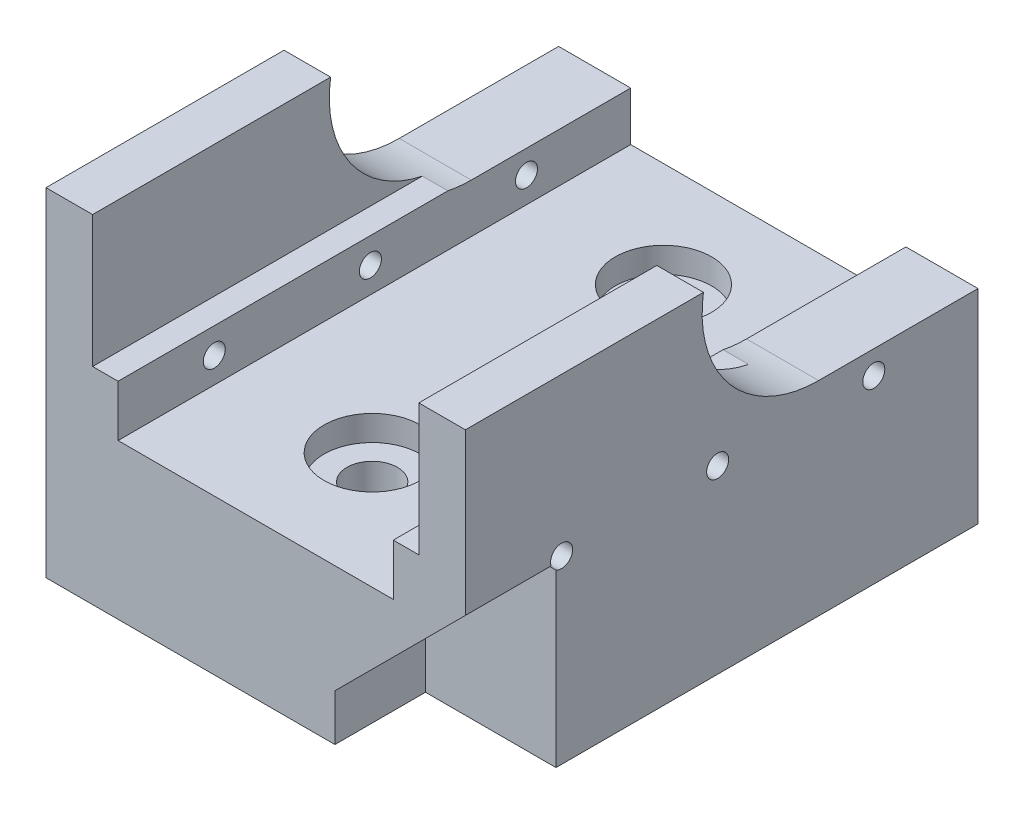
ISO-10303-21;
HEADER;
FILE_DESCRIPTION(('STEP AP214'),'2;1');
FILE_NAME('part.step','',(''),(''),'','','');
FILE_SCHEMA(('AUTOMOTIVE_DESIGN { 1 0 10303 214 1 1 1 1 }'));
ENDSEC;
DATA;
#1=APPLICATION_CONTEXT('core data for automotive mechanical design processes');
#2=APPLICATION_PROTOCOL_DEFINITION('international standard','automotive_design',2000,#1);
#3=PRODUCT_CONTEXT('',#1,'mechanical');
#4=PRODUCT('Part','Part','',(#3));
#5=PRODUCT_RELATED_PRODUCT_CATEGORY('part','',(#4));
#6=PRODUCT_DEFINITION_FORMATION('','',#4);
#7=PRODUCT_DEFINITION_CONTEXT('part definition',#1,'design');
#8=PRODUCT_DEFINITION('design','',#6,#7);
#9=PRODUCT_DEFINITION_SHAPE('','',#8);
#10=(LENGTH_UNIT() NAMED_UNIT(*) SI_UNIT(.MILLI.,.METRE.));
#11=(NAMED_UNIT(*) PLANE_ANGLE_UNIT() SI_UNIT($,.RADIAN.));
#12=(NAMED_UNIT(*) SI_UNIT($,.STERADIAN.) SOLID_ANGLE_UNIT());
#13=UNCERTAINTY_MEASURE_WITH_UNIT(LENGTH_MEASURE(1.E-05),#10,'distance_accuracy_value','');
#14=(GEOMETRIC_REPRESENTATION_CONTEXT(3) GLOBAL_UNCERTAINTY_ASSIGNED_CONTEXT((#13)) GLOBAL_UNIT_ASSIGNED_CONTEXT((#10,
#11,#12)) REPRESENTATION_CONTEXT('',''));
#15=CARTESIAN_POINT('',(0.,0.,0.));
#16=DIRECTION('',(0.,0.,1.));
#17=DIRECTION('',(1.,0.,0.));
#18=AXIS2_PLACEMENT_3D('',#15,#16,#17);
#19=CARTESIAN_POINT('',(-14.9999954,27.305,-30.48));
#20=DIRECTION('',(-1.,0.,0.));
#21=DIRECTION('',(0.,0.,1.));
#22=AXIS2_PLACEMENT_3D('',#19,#20,#21);
#23=PLANE('',#22);
#24=CARTESIAN_POINT('',(-14.9999954,10.16,-2.1008086));
#25=DIRECTION('',(-1.,0.,0.));
#26=DIRECTION('',(0.,0.,1.));
#27=AXIS2_PLACEMENT_3D('',#24,#25,#26);
#28=CIRCLE('',#27,1.19999999999999);
#29=CARTESIAN_POINT('',(-14.9999954,10.16,-0.900808600000012));
#30=VERTEX_POINT('',#29);
#31=EDGE_CURVE('E265',#30,#30,#28,.T.);
#32=ORIENTED_EDGE('',*,*,#31,.T.);
#33=EDGE_LOOP('',(#32));
#34=FACE_BOUND('',#33,.T.);
#35=CARTESIAN_POINT('',(-14.9999954,10.16,14.9171914));
#36=DIRECTION('',(-1.,0.,0.));
#37=DIRECTION('',(0.,0.,1.));
#38=AXIS2_PLACEMENT_3D('',#35,#36,#37);
#39=CIRCLE('',#38,1.19999999999999);
#40=CARTESIAN_POINT('',(-14.9999954,10.16,16.1171914));
#41=VERTEX_POINT('',#40);
#42=EDGE_CURVE('E277',#41,#41,#39,.T.);
#43=ORIENTED_EDGE('',*,*,#42,.T.);
#44=EDGE_LOOP('',(#43));
#45=FACE_BOUND('',#44,.T.);
#46=CARTESIAN_POINT('',(-14.9999954,10.16,-19.1188086));
#47=DIRECTION('',(-1.,0.,0.));
#48=DIRECTION('',(0.,0.,1.));
#49=AXIS2_PLACEMENT_3D('',#46,#47,#48);
#50=CIRCLE('',#49,1.19999999999999);
#51=CARTESIAN_POINT('',(-14.9999954,10.16,-17.9188086));
#52=VERTEX_POINT('',#51);
#53=EDGE_CURVE('E309',#52,#52,#50,.T.);
#54=ORIENTED_EDGE('',*,*,#53,.T.);
#55=EDGE_LOOP('',(#54));
#56=FACE_BOUND('',#55,.T.);
#57=DIRECTION('',(0.,1.,0.));
#58=VECTOR('',#57,1.);
#59=CARTESIAN_POINT('',(-14.9999954,27.305,25.4000000000001));
#60=LINE('',#59,#58);
#61=CARTESIAN_POINT('',(-14.9999954,7.3600056,25.4000000000001));
#62=VERTEX_POINT('',#61);
#63=CARTESIAN_POINT('',(-14.9999954,12.9600198000048,25.4000000000001));
#64=VERTEX_POINT('',#63);
#65=EDGE_CURVE('E322',#62,#64,#60,.T.);
#66=ORIENTED_EDGE('',*,*,#65,.F.);
#67=DIRECTION('',(0.,0.,1.));
#68=VECTOR('',#67,1.);
#69=CARTESIAN_POINT('',(-14.9999954,7.3600056,30.4800000000251));
#70=LINE('',#69,#68);
#71=CARTESIAN_POINT('',(-14.9999954,7.3600056,-30.48));
#72=VERTEX_POINT('',#71);
#73=EDGE_CURVE('E329',#72,#62,#70,.T.);
#74=ORIENTED_EDGE('',*,*,#73,.F.);
#75=DIRECTION('',(0.,-1.,0.));
#76=VECTOR('',#75,1.);
#77=CARTESIAN_POINT('',(-14.9999954,27.305,-30.48));
#78=LINE('',#77,#76);
#79=CARTESIAN_POINT('',(-14.9999954,12.7,-30.48));
#80=VERTEX_POINT('',#79);
#81=EDGE_CURVE('E290',#80,#72,#78,.T.);
#82=ORIENTED_EDGE('',*,*,#81,.F.);
#83=DIRECTION('',(0.,0.,1.));
#84=VECTOR('',#83,1.);
#85=CARTESIAN_POINT('',(-14.9999954,12.7,-30.48));
#86=LINE('',#85,#84);
#87=CARTESIAN_POINT('',(-14.9999954,12.7,-13.105000048));
#88=VERTEX_POINT('',#87);
#89=EDGE_CURVE('E246',#80,#88,#86,.T.);
#90=ORIENTED_EDGE('',*,*,#89,.T.);
#91=CARTESIAN_POINT('',(-14.9999954,25.4,-13.105000048));
#92=DIRECTION('',(-1.,0.,0.));
#93=DIRECTION('',(0.,0.,1.));
#94=AXIS2_PLACEMENT_3D('',#91,#92,#93);
#95=CIRCLE('',#94,12.7);
#96=CARTESIAN_POINT('',(-14.9999954,12.9600198000048,-10.5482652898117));
#97=VERTEX_POINT('',#96);
#98=EDGE_CURVE('E231',#88,#97,#95,.T.);
#99=ORIENTED_EDGE('',*,*,#98,.T.);
#100=DIRECTION('',(0.,0.,1.));
#101=VECTOR('',#100,1.);
#102=CARTESIAN_POINT('',(-14.9999954,12.9600198000048,-30.48));
#103=LINE('',#102,#101);
#104=EDGE_CURVE('E256',#97,#64,#103,.T.);
#105=ORIENTED_EDGE('',*,*,#104,.T.);
#106=EDGE_LOOP('',(#66,#74,#82,#90,#99,#105));
#107=FACE_BOUND('',#106,.T.);
#108=ADVANCED_FACE('F36',(#34,#45,#56,#107),#23,.F.);
#109=CARTESIAN_POINT('',(14.9999954,27.305,-30.48));
#110=DIRECTION('',(1.,0.,0.));
#111=DIRECTION('',(0.,0.,-1.));
#112=AXIS2_PLACEMENT_3D('',#109,#110,#111);
#113=PLANE('',#112);
#114=CARTESIAN_POINT('',(14.9999954,10.16,-2.1008086));
#115=DIRECTION('',(1.,0.,0.));
#116=DIRECTION('',(0.,0.,-1.));
#117=AXIS2_PLACEMENT_3D('',#114,#115,#116);
#118=CIRCLE('',#117,1.19999999999999);
#119=CARTESIAN_POINT('',(14.9999954,10.16,-3.3008086));
#120=VERTEX_POINT('',#119);
#121=EDGE_CURVE('E271',#120,#120,#118,.T.);
#122=ORIENTED_EDGE('',*,*,#121,.T.);
#123=EDGE_LOOP('',(#122));
#124=FACE_BOUND('',#123,.T.);
#125=CARTESIAN_POINT('',(14.9999954,10.16,14.9171914));
#126=DIRECTION('',(1.,0.,0.));
#127=DIRECTION('',(0.,0.,-1.));
#128=AXIS2_PLACEMENT_3D('',#125,#126,#127);
#129=CIRCLE('',#128,1.19999999999999);
#130=CARTESIAN_POINT('',(14.9999954,10.16,13.7171914));
#131=VERTEX_POINT('',#130);
#132=EDGE_CURVE('E279',#131,#131,#129,.T.);
#133=ORIENTED_EDGE('',*,*,#132,.T.);
#134=EDGE_LOOP('',(#133));
#135=FACE_BOUND('',#134,.T.);
#136=CARTESIAN_POINT('',(14.9999954,10.16,-19.1188086));
#137=DIRECTION('',(1.,0.,0.));
#138=DIRECTION('',(0.,0.,-1.));
#139=AXIS2_PLACEMENT_3D('',#136,#137,#138);
#140=CIRCLE('',#139,1.19999999999999);
#141=CARTESIAN_POINT('',(14.9999954,10.16,-20.3188086));
#142=VERTEX_POINT('',#141);
#143=EDGE_CURVE('E303',#142,#142,#140,.T.);
#144=ORIENTED_EDGE('',*,*,#143,.T.);
#145=EDGE_LOOP('',(#144));
#146=FACE_BOUND('',#145,.T.);
#147=DIRECTION('',(0.,-1.,0.));
#148=VECTOR('',#147,1.);
#149=CARTESIAN_POINT('',(14.9999954,27.305,25.4000000000004));
#150=LINE('',#149,#148);
#151=CARTESIAN_POINT('',(14.9999954,12.9600198000048,25.4000000000004));
#152=VERTEX_POINT('',#151);
#153=CARTESIAN_POINT('',(14.9999954,7.3600056,25.4000000000002));
#154=VERTEX_POINT('',#153);
#155=EDGE_CURVE('E59',#152,#154,#150,.T.);
#156=ORIENTED_EDGE('',*,*,#155,.F.);
#157=DIRECTION('',(0.,0.,-1.));
#158=VECTOR('',#157,1.);
#159=CARTESIAN_POINT('',(14.9999954,12.9600198000048,-30.48));
#160=LINE('',#159,#158);
#161=CARTESIAN_POINT('',(14.9999954,12.9600198000048,-10.5482652898117));
#162=VERTEX_POINT('',#161);
#163=EDGE_CURVE('E312',#152,#162,#160,.T.);
#164=ORIENTED_EDGE('',*,*,#163,.T.);
#165=CARTESIAN_POINT('',(14.9999954,25.4,-13.105000048));
#166=DIRECTION('',(1.,0.,0.));
#167=DIRECTION('',(0.,0.,-1.));
#168=AXIS2_PLACEMENT_3D('',#165,#166,#167);
#169=CIRCLE('',#168,12.7);
#170=CARTESIAN_POINT('',(14.9999954,12.7,-13.105000048));
#171=VERTEX_POINT('',#170);
#172=EDGE_CURVE('E240',#162,#171,#169,.T.);
#173=ORIENTED_EDGE('',*,*,#172,.T.);
#174=DIRECTION('',(0.,0.,-1.));
#175=VECTOR('',#174,1.);
#176=CARTESIAN_POINT('',(14.9999954,12.7,-30.48));
#177=LINE('',#176,#175);
#178=CARTESIAN_POINT('',(14.9999954,12.7,-30.48));
#179=VERTEX_POINT('',#178);
#180=EDGE_CURVE('E317',#171,#179,#177,.T.);
#181=ORIENTED_EDGE('',*,*,#180,.T.);
#182=DIRECTION('',(0.,-1.,0.));
#183=VECTOR('',#182,1.);
#184=CARTESIAN_POINT('',(14.9999954,27.305,-30.48));
#185=LINE('',#184,#183);
#186=CARTESIAN_POINT('',(14.9999954,7.3600056,-30.48));
#187=VERTEX_POINT('',#186);
#188=EDGE_CURVE('E282',#179,#187,#185,.T.);
#189=ORIENTED_EDGE('',*,*,#188,.T.);
#190=DIRECTION('',(0.,0.,-1.));
#191=VECTOR('',#190,1.);
#192=CARTESIAN_POINT('',(14.9999954,7.3600056,30.4800000000251));
#193=LINE('',#192,#191);
#194=EDGE_CURVE('E337',#154,#187,#193,.T.);
#195=ORIENTED_EDGE('',*,*,#194,.F.);
#196=EDGE_LOOP('',(#156,#164,#173,#181,#189,#195));
#197=FACE_BOUND('',#196,.T.);
#198=ADVANCED_FACE('F445',(#124,#135,#146,#197),#113,.F.);
#199=CARTESIAN_POINT('',(0.,27.305,0.));
#200=DIRECTION('',(0.,1.,0.));
#201=DIRECTION('',(0.,0.,1.));
#202=AXIS2_PLACEMENT_3D('',#199,#200,#201);
#203=PLANE('',#202);
#204=DIRECTION('',(0.,0.,-1.));
#205=VECTOR('',#204,1.);
#206=CARTESIAN_POINT('',(17.78,27.3050000000126,400000.));
#207=LINE('',#206,#205);
#208=CARTESIAN_POINT('',(17.78,27.3050000000126,25.4000000000004));
#209=VERTEX_POINT('',#208);
#210=CARTESIAN_POINT('',(17.78,27.3050000000126,-0.548687890365808));
#211=VERTEX_POINT('',#210);
#212=EDGE_CURVE('E250',#209,#211,#207,.T.);
#213=ORIENTED_EDGE('',*,*,#212,.F.);
#214=DIRECTION('',(-1.,0.,0.));
#215=VECTOR('',#214,1.);
#216=CARTESIAN_POINT('',(-22.8599999999999,27.3050000000126,25.4));
#217=LINE('',#216,#215);
#218=CARTESIAN_POINT('',(22.8600000000001,27.3050000000126,25.4000000000005));
#219=VERTEX_POINT('',#218);
#220=EDGE_CURVE('E374',#219,#209,#217,.T.);
#221=ORIENTED_EDGE('',*,*,#220,.F.);
#222=DIRECTION('',(0.,0.,-1.));
#223=VECTOR('',#222,1.);
#224=CARTESIAN_POINT('',(22.86,27.305,-30.48));
#225=LINE('',#224,#223);
#226=CARTESIAN_POINT('',(22.86,27.305,-0.548687890363902));
#227=VERTEX_POINT('',#226);
#228=EDGE_CURVE('E285',#219,#227,#225,.T.);
#229=ORIENTED_EDGE('',*,*,#228,.T.);
#230=DIRECTION('',(1.,0.,0.));
#231=VECTOR('',#230,1.);
#232=CARTESIAN_POINT('',(-22.86,27.305,-0.548687890363903));
#233=LINE('',#232,#231);
#234=EDGE_CURVE('E243',#211,#227,#233,.T.);
#235=ORIENTED_EDGE('',*,*,#234,.F.);
#236=EDGE_LOOP('',(#213,#221,#229,#235));
#237=FACE_BOUND('',#236,.T.);
#238=ADVANCED_FACE('F372',(#237),#203,.T.);
#239=CARTESIAN_POINT('',(0.,27.305,0.));
#240=DIRECTION('',(0.,1.,0.));
#241=DIRECTION('',(0.,0.,1.));
#242=AXIS2_PLACEMENT_3D('',#239,#240,#241);
#243=PLANE('',#242);
#244=DIRECTION('',(0.,0.,1.));
#245=VECTOR('',#244,1.);
#246=CARTESIAN_POINT('',(-22.86,27.305,-30.48));
#247=LINE('',#246,#245);
#248=CARTESIAN_POINT('',(-22.86,27.305,-0.548687890363902));
#249=VERTEX_POINT('',#248);
#250=CARTESIAN_POINT('',(-22.8599999999999,27.3050000000126,25.4));
#251=VERTEX_POINT('',#250);
#252=EDGE_CURVE('E287',#249,#251,#247,.T.);
#253=ORIENTED_EDGE('',*,*,#252,.T.);
#254=CARTESIAN_POINT('',(-17.78,27.3050000000126,25.4));
#255=VERTEX_POINT('',#254);
#256=EDGE_CURVE('E485',#255,#251,#217,.T.);
#257=ORIENTED_EDGE('',*,*,#256,.F.);
#258=DIRECTION('',(0.,0.,-1.));
#259=VECTOR('',#258,1.);
#260=CARTESIAN_POINT('',(-17.78,27.3050000000126,400000.));
#261=LINE('',#260,#259);
#262=CARTESIAN_POINT('',(-17.78,27.3050000000126,-0.548687890365808));
#263=VERTEX_POINT('',#262);
#264=EDGE_CURVE('E249',#255,#263,#261,.T.);
#265=ORIENTED_EDGE('',*,*,#264,.T.);
#266=DIRECTION('',(1.,0.,0.));
#267=VECTOR('',#266,1.);
#268=CARTESIAN_POINT('',(-22.86,27.305,-0.548687890363903));
#269=LINE('',#268,#267);
#270=EDGE_CURVE('E228',#249,#263,#269,.T.);
#271=ORIENTED_EDGE('',*,*,#270,.F.);
#272=EDGE_LOOP('',(#253,#257,#265,#271));
#273=FACE_BOUND('',#272,.T.);
#274=ADVANCED_FACE('F456',(#273),#243,.T.);
#275=CARTESIAN_POINT('',(-22.86,6.35,-30.48));
#276=DIRECTION('',(1.,0.,0.));
#277=DIRECTION('',(0.,0.,-1.));
#278=AXIS2_PLACEMENT_3D('',#275,#276,#277);
#279=PLANE('',#278);
#280=CARTESIAN_POINT('',(-22.86,10.16,-19.1188086));
#281=DIRECTION('',(1.,0.,0.));
#282=DIRECTION('',(0.,0.,-1.));
#283=AXIS2_PLACEMENT_3D('',#280,#281,#282);
#284=CIRCLE('',#283,1.19999999999999);
#285=CARTESIAN_POINT('',(-22.86,10.16,-20.3188086));
#286=VERTEX_POINT('',#285);
#287=EDGE_CURVE('E306',#286,#286,#284,.F.);
#288=ORIENTED_EDGE('',*,*,#287,.F.);
#289=EDGE_LOOP('',(#288));
#290=FACE_BOUND('',#289,.T.);
#291=CARTESIAN_POINT('',(-22.86,10.16,14.9171914));
#292=DIRECTION('',(1.,0.,0.));
#293=DIRECTION('',(0.,0.,-1.));
#294=AXIS2_PLACEMENT_3D('',#291,#292,#293);
#295=CIRCLE('',#294,1.19999999999999);
#296=CARTESIAN_POINT('',(-22.86,10.16,13.7171914));
#297=VERTEX_POINT('',#296);
#298=EDGE_CURVE('E274',#297,#297,#295,.F.);
#299=ORIENTED_EDGE('',*,*,#298,.F.);
#300=EDGE_LOOP('',(#299));
#301=FACE_BOUND('',#300,.T.);
#302=CARTESIAN_POINT('',(-22.86,10.16,-2.1008086));
#303=DIRECTION('',(1.,0.,0.));
#304=DIRECTION('',(0.,0.,-1.));
#305=AXIS2_PLACEMENT_3D('',#302,#303,#304);
#306=CIRCLE('',#305,1.19999999999999);
#307=CARTESIAN_POINT('',(-22.86,10.16,-3.3008086));
#308=VERTEX_POINT('',#307);
#309=EDGE_CURVE('E262',#308,#308,#306,.F.);
#310=ORIENTED_EDGE('',*,*,#309,.F.);
#311=EDGE_LOOP('',(#310));
#312=FACE_BOUND('',#311,.T.);
#313=DIRECTION('',(0.,-1.,0.));
#314=VECTOR('',#313,1.);
#315=CARTESIAN_POINT('',(-22.8599999999999,-9.525,25.4));
#316=LINE('',#315,#314);
#317=CARTESIAN_POINT('',(-22.8599999999999,-9.525,25.4));
#318=VERTEX_POINT('',#317);
#319=EDGE_CURVE('E376',#251,#318,#316,.T.);
#320=ORIENTED_EDGE('',*,*,#319,.F.);
#321=ORIENTED_EDGE('',*,*,#252,.F.);
#322=CARTESIAN_POINT('',(-22.86,25.4,-13.105000048));
#323=DIRECTION('',(1.,0.,0.));
#324=DIRECTION('',(0.,0.,-1.));
#325=AXIS2_PLACEMENT_3D('',#322,#323,#324);
#326=CIRCLE('',#325,12.7);
#327=CARTESIAN_POINT('',(-22.86,12.7,-13.105000048));
#328=VERTEX_POINT('',#327);
#329=EDGE_CURVE('E210',#249,#328,#326,.T.);
#330=ORIENTED_EDGE('',*,*,#329,.T.);
#331=DIRECTION('',(0.,0.,-1.));
#332=VECTOR('',#331,1.);
#333=CARTESIAN_POINT('',(-22.86,12.7,-13.105000048));
#334=LINE('',#333,#332);
#335=CARTESIAN_POINT('',(-22.86,12.7,-30.48));
#336=VERTEX_POINT('',#335);
#337=EDGE_CURVE('E213',#328,#336,#334,.T.);
#338=ORIENTED_EDGE('',*,*,#337,.T.);
#339=DIRECTION('',(0.,-1.,0.));
#340=VECTOR('',#339,1.);
#341=CARTESIAN_POINT('',(-22.86,6.35,-30.48));
#342=LINE('',#341,#340);
#343=CARTESIAN_POINT('',(-22.86,-9.525,-30.48));
#344=VERTEX_POINT('',#343);
#345=EDGE_CURVE('E293',#336,#344,#342,.T.);
#346=ORIENTED_EDGE('',*,*,#345,.T.);
#347=DIRECTION('',(0.,0.,-1.));
#348=VECTOR('',#347,1.);
#349=CARTESIAN_POINT('',(-22.86,-9.525,30.48));
#350=LINE('',#349,#348);
#351=EDGE_CURVE('E206',#318,#344,#350,.T.);
#352=ORIENTED_EDGE('',*,*,#351,.F.);
#353=EDGE_LOOP('',(#320,#321,#330,#338,#346,#352));
#354=FACE_BOUND('',#353,.T.);
#355=ADVANCED_FACE('F353',(#290,#301,#312,#354),#279,.F.);
#356=CARTESIAN_POINT('',(22.86,6.35,-30.48));
#357=DIRECTION('',(-1.,0.,0.));
#358=DIRECTION('',(0.,0.,1.));
#359=AXIS2_PLACEMENT_3D('',#356,#357,#358);
#360=PLANE('',#359);
#361=CARTESIAN_POINT('',(22.86,10.16,-19.1188086));
#362=DIRECTION('',(1.,0.,0.));
#363=DIRECTION('',(0.,0.,-1.));
#364=AXIS2_PLACEMENT_3D('',#361,#362,#363);
#365=CIRCLE('',#364,1.19999999999999);
#366=CARTESIAN_POINT('',(22.86,10.16,-20.3188086));
#367=VERTEX_POINT('',#366);
#368=EDGE_CURVE('E298',#367,#367,#365,.T.);
#369=ORIENTED_EDGE('',*,*,#368,.F.);
#370=EDGE_LOOP('',(#369));
#371=FACE_BOUND('',#370,.T.);
#372=CARTESIAN_POINT('',(22.86,10.16,-2.1008086));
#373=DIRECTION('',(1.,0.,0.));
#374=DIRECTION('',(0.,0.,-1.));
#375=AXIS2_PLACEMENT_3D('',#372,#373,#374);
#376=CIRCLE('',#375,1.19999999999999);
#377=CARTESIAN_POINT('',(22.86,10.16,-3.3008086));
#378=VERTEX_POINT('',#377);
#379=EDGE_CURVE('E268',#378,#378,#376,.T.);
#380=ORIENTED_EDGE('',*,*,#379,.F.);
#381=EDGE_LOOP('',(#380));
#382=FACE_BOUND('',#381,.T.);
#383=DIRECTION('',(0.,-1.,0.));
#384=VECTOR('',#383,1.);
#385=CARTESIAN_POINT('',(22.8600000000001,-9.525,25.4000000000005));
#386=LINE('',#385,#384);
#387=CARTESIAN_POINT('',(22.8600000000001,9.77899999999995,25.4000000000005));
#388=VERTEX_POINT('',#387);
#389=EDGE_CURVE('E375',#219,#388,#386,.T.);
#390=ORIENTED_EDGE('',*,*,#389,.T.);
#391=DIRECTION('',(0.,0.,1.));
#392=VECTOR('',#391,1.);
#393=CARTESIAN_POINT('',(22.8600000000001,9.77899999999995,15.5259999680002));
#394=LINE('',#393,#392);
#395=CARTESIAN_POINT('',(22.8600000000001,9.77899999999995,16.0551013261365));
#396=VERTEX_POINT('',#395);
#397=EDGE_CURVE('E51',#396,#388,#394,.T.);
#398=ORIENTED_EDGE('',*,*,#397,.F.);
#399=CARTESIAN_POINT('',(22.86,10.16,14.9171914));
#400=DIRECTION('',(1.,0.,0.));
#401=DIRECTION('',(0.,0.,-1.));
#402=AXIS2_PLACEMENT_3D('',#399,#400,#401);
#403=CIRCLE('',#402,1.19999999999999);
#404=CARTESIAN_POINT('',(22.8600000000001,9.12590516511807,15.5259999680002));
#405=VERTEX_POINT('',#404);
#406=EDGE_CURVE('E193',#405,#396,#403,.T.);
#407=ORIENTED_EDGE('',*,*,#406,.F.);
#408=DIRECTION('',(0.,1.,0.));
#409=VECTOR('',#408,1.);
#410=CARTESIAN_POINT('',(22.8600000000001,-9.525,15.5259999680002));
#411=LINE('',#410,#409);
#412=CARTESIAN_POINT('',(22.8600000000001,-9.525,15.5259999680002));
#413=VERTEX_POINT('',#412);
#414=EDGE_CURVE('E176',#413,#405,#411,.T.);
#415=ORIENTED_EDGE('',*,*,#414,.F.);
#416=DIRECTION('',(0.,0.,1.));
#417=VECTOR('',#416,1.);
#418=CARTESIAN_POINT('',(22.86,-9.525,30.48));
#419=LINE('',#418,#417);
#420=CARTESIAN_POINT('',(22.86,-9.525,-30.48));
#421=VERTEX_POINT('',#420);
#422=EDGE_CURVE('E191',#421,#413,#419,.T.);
#423=ORIENTED_EDGE('',*,*,#422,.F.);
#424=DIRECTION('',(0.,-1.,0.));
#425=VECTOR('',#424,1.);
#426=CARTESIAN_POINT('',(22.86,6.35,-30.48));
#427=LINE('',#426,#425);
#428=CARTESIAN_POINT('',(22.86,12.7,-30.48));
#429=VERTEX_POINT('',#428);
#430=EDGE_CURVE('E296',#429,#421,#427,.T.);
#431=ORIENTED_EDGE('',*,*,#430,.F.);
#432=DIRECTION('',(0.,0.,-1.));
#433=VECTOR('',#432,1.);
#434=CARTESIAN_POINT('',(22.86,12.7,-13.105000048));
#435=LINE('',#434,#433);
#436=CARTESIAN_POINT('',(22.86,12.7,-13.105000048));
#437=VERTEX_POINT('',#436);
#438=EDGE_CURVE('E204',#437,#429,#435,.T.);
#439=ORIENTED_EDGE('',*,*,#438,.F.);
#440=CARTESIAN_POINT('',(22.86,25.4,-13.105000048));
#441=DIRECTION('',(1.,0.,0.));
#442=DIRECTION('',(0.,0.,-1.));
#443=AXIS2_PLACEMENT_3D('',#440,#441,#442);
#444=CIRCLE('',#443,12.7);
#445=EDGE_CURVE('E201',#227,#437,#444,.T.);
#446=ORIENTED_EDGE('',*,*,#445,.F.);
#447=ORIENTED_EDGE('',*,*,#228,.F.);
#448=EDGE_LOOP('',(#390,#398,#407,#415,#423,#431,#439,#446,#447));
#449=FACE_BOUND('',#448,.T.);
#450=ADVANCED_FACE('F189',(#371,#382,#449),#360,.F.);
#451=CARTESIAN_POINT('',(17.78,0.,0.));
#452=DIRECTION('',(-1.,0.,0.));
#453=DIRECTION('',(0.,0.,1.));
#454=AXIS2_PLACEMENT_3D('',#451,#452,#453);
#455=PLANE('',#454);
#456=DIRECTION('',(0.,0.,1.));
#457=VECTOR('',#456,1.);
#458=CARTESIAN_POINT('',(17.78,12.9600198000048,400000.));
#459=LINE('',#458,#457);
#460=CARTESIAN_POINT('',(17.78,12.9600198000048,-10.5482652898117));
#461=VERTEX_POINT('',#460);
#462=CARTESIAN_POINT('',(17.78,12.9600198000048,25.3999999999905));
#463=VERTEX_POINT('',#462);
#464=EDGE_CURVE('E252',#461,#463,#459,.T.);
#465=ORIENTED_EDGE('',*,*,#464,.T.);
#466=DIRECTION('',(0.,1.,0.));
#467=VECTOR('',#466,1.);
#468=CARTESIAN_POINT('',(17.78,0.,25.4000000000004));
#469=LINE('',#468,#467);
#470=EDGE_CURVE('E385',#463,#209,#469,.T.);
#471=ORIENTED_EDGE('',*,*,#470,.T.);
#472=ORIENTED_EDGE('',*,*,#212,.T.);
#473=CARTESIAN_POINT('',(17.78,25.4,-13.105000048));
#474=DIRECTION('',(-1.,0.,0.));
#475=DIRECTION('',(0.,0.,1.));
#476=AXIS2_PLACEMENT_3D('',#473,#474,#475);
#477=CIRCLE('',#476,12.7);
#478=EDGE_CURVE('E237',#461,#211,#477,.T.);
#479=ORIENTED_EDGE('',*,*,#478,.F.);
#480=EDGE_LOOP('',(#465,#471,#472,#479));
#481=FACE_BOUND('',#480,.T.);
#482=ADVANCED_FACE('F464',(#481),#455,.T.);
#483=CARTESIAN_POINT('',(17.78,12.9600198000048,400000.));
#484=DIRECTION('',(0.,-1.,0.));
#485=DIRECTION('',(0.,0.,-1.));
#486=AXIS2_PLACEMENT_3D('',#483,#484,#485);
#487=PLANE('',#486);
#488=DIRECTION('',(-1.,0.,0.));
#489=VECTOR('',#488,1.);
#490=CARTESIAN_POINT('',(17.7800000041279,12.9600198000048,25.3999999999905));
#491=LINE('',#490,#489);
#492=EDGE_CURVE('E383',#463,#152,#491,.T.);
#493=ORIENTED_EDGE('',*,*,#492,.F.);
#494=ORIENTED_EDGE('',*,*,#464,.F.);
#495=DIRECTION('',(1.,0.,0.));
#496=VECTOR('',#495,1.);
#497=CARTESIAN_POINT('',(-22.86,12.9600198000048,-10.5482652898117));
#498=LINE('',#497,#496);
#499=EDGE_CURVE('E234',#461,#162,#498,.F.);
#500=ORIENTED_EDGE('',*,*,#499,.T.);
#501=ORIENTED_EDGE('',*,*,#163,.F.);
#502=EDGE_LOOP('',(#493,#494,#500,#501));
#503=FACE_BOUND('',#502,.T.);
#504=ADVANCED_FACE('F482',(#503),#487,.F.);
#505=DIRECTION('',(-1.,0.,0.));
#506=VECTOR('',#505,1.);
#507=CARTESIAN_POINT('',(17.7800000041279,12.9600198000048,25.3999999999905));
#508=LINE('',#507,#506);
#509=CARTESIAN_POINT('',(-17.78,12.9600198000048,25.3999999999902));
#510=VERTEX_POINT('',#509);
#511=EDGE_CURVE('E331',#64,#510,#508,.T.);
#512=ORIENTED_EDGE('',*,*,#511,.F.);
#513=ORIENTED_EDGE('',*,*,#104,.F.);
#514=DIRECTION('',(1.,0.,0.));
#515=VECTOR('',#514,1.);
#516=CARTESIAN_POINT('',(-22.86,12.9600198000048,-10.5482652898117));
#517=LINE('',#516,#515);
#518=CARTESIAN_POINT('',(-17.78,12.9600198000048,-10.5482652898117));
#519=VERTEX_POINT('',#518);
#520=EDGE_CURVE('E221',#97,#519,#517,.F.);
#521=ORIENTED_EDGE('',*,*,#520,.T.);
#522=DIRECTION('',(0.,0.,1.));
#523=VECTOR('',#522,1.);
#524=CARTESIAN_POINT('',(-17.78,12.9600198000048,400000.));
#525=LINE('',#524,#523);
#526=EDGE_CURVE('E253',#519,#510,#525,.T.);
#527=ORIENTED_EDGE('',*,*,#526,.T.);
#528=EDGE_LOOP('',(#512,#513,#521,#527));
#529=FACE_BOUND('',#528,.T.);
#530=ADVANCED_FACE('F516',(#529),#487,.F.);
#531=CARTESIAN_POINT('',(-17.78,0.,0.));
#532=DIRECTION('',(-1.,0.,0.));
#533=DIRECTION('',(0.,0.,1.));
#534=AXIS2_PLACEMENT_3D('',#531,#532,#533);
#535=PLANE('',#534);
#536=DIRECTION('',(0.,1.,0.));
#537=VECTOR('',#536,1.);
#538=CARTESIAN_POINT('',(-17.78,0.,25.4));
#539=LINE('',#538,#537);
#540=EDGE_CURVE('E388',#510,#255,#539,.T.);
#541=ORIENTED_EDGE('',*,*,#540,.F.);
#542=ORIENTED_EDGE('',*,*,#526,.F.);
#543=CARTESIAN_POINT('',(-17.78,25.4,-13.105000048));
#544=DIRECTION('',(-1.,0.,0.));
#545=DIRECTION('',(0.,0.,1.));
#546=AXIS2_PLACEMENT_3D('',#543,#544,#545);
#547=CIRCLE('',#546,12.7);
#548=EDGE_CURVE('E314',#519,#263,#547,.T.);
#549=ORIENTED_EDGE('',*,*,#548,.T.);
#550=ORIENTED_EDGE('',*,*,#264,.F.);
#551=EDGE_LOOP('',(#541,#542,#549,#550));
#552=FACE_BOUND('',#551,.T.);
#553=ADVANCED_FACE('F514',(#552),#535,.F.);
#554=CARTESIAN_POINT('',(0.,-9.525,0.));
#555=DIRECTION('',(0.,-1.,0.));
#556=DIRECTION('',(0.,0.,-1.));
#557=AXIS2_PLACEMENT_3D('',#554,#555,#556);
#558=PLANE('',#557);
#559=DIRECTION('',(0.,0.,1.));
#560=VECTOR('',#559,1.);
#561=CARTESIAN_POINT('',(8.63600000000006,-9.525,15.5259999680002));
#562=LINE('',#561,#560);
#563=CARTESIAN_POINT('',(8.63600000000006,-9.525,15.5259999680002));
#564=VERTEX_POINT('',#563);
#565=CARTESIAN_POINT('',(8.63600000000006,-9.525,25.4000000000002));
#566=VERTEX_POINT('',#565);
#567=EDGE_CURVE('E490',#564,#566,#562,.T.);
#568=ORIENTED_EDGE('',*,*,#567,.T.);
#569=DIRECTION('',(-1.,0.,0.));
#570=VECTOR('',#569,1.);
#571=CARTESIAN_POINT('',(-2.62135991925387E-13,-9.525,25.4000000000002));
#572=LINE('',#571,#570);
#573=EDGE_CURVE('E348',#566,#318,#572,.T.);
#574=ORIENTED_EDGE('',*,*,#573,.T.);
#575=ORIENTED_EDGE('',*,*,#351,.T.);
#576=DIRECTION('',(1.,0.,0.));
#577=VECTOR('',#576,1.);
#578=CARTESIAN_POINT('',(-22.86,-9.525,-30.48));
#579=LINE('',#578,#577);
#580=EDGE_CURVE('E200',#344,#421,#579,.T.);
#581=ORIENTED_EDGE('',*,*,#580,.T.);
#582=ORIENTED_EDGE('',*,*,#422,.T.);
#583=DIRECTION('',(1.,0.,0.));
#584=VECTOR('',#583,1.);
#585=CARTESIAN_POINT('',(8.63600000000006,-9.525,15.5259999680002));
#586=LINE('',#585,#584);
#587=EDGE_CURVE('E173',#564,#413,#586,.T.);
#588=ORIENTED_EDGE('',*,*,#587,.F.);
#589=EDGE_LOOP('',(#568,#574,#575,#581,#582,#588));
#590=FACE_BOUND('',#589,.T.);
#591=CARTESIAN_POINT('',(0.,-9.525,12.7));
#592=DIRECTION('',(0.,1.,0.));
#593=DIRECTION('',(0.,0.,1.));
#594=AXIS2_PLACEMENT_3D('',#591,#592,#593);
#595=CIRCLE('',#594,2.75);
#596=CARTESIAN_POINT('',(0.,-9.525,15.45));
#597=VERTEX_POINT('',#596);
#598=EDGE_CURVE('E400',#597,#597,#595,.T.);
#599=ORIENTED_EDGE('',*,*,#598,.T.);
#600=EDGE_LOOP('',(#599));
#601=FACE_BOUND('',#600,.T.);
#602=CARTESIAN_POINT('',(0.,-9.525,-19.05));
#603=DIRECTION('',(0.,1.,0.));
#604=DIRECTION('',(0.,0.,1.));
#605=AXIS2_PLACEMENT_3D('',#602,#603,#604);
#606=CIRCLE('',#605,2.75);
#607=CARTESIAN_POINT('',(0.,-9.525,-16.3));
#608=VERTEX_POINT('',#607);
#609=EDGE_CURVE('E338',#608,#608,#606,.T.);
#610=ORIENTED_EDGE('',*,*,#609,.T.);
#611=EDGE_LOOP('',(#610));
#612=FACE_BOUND('',#611,.T.);
#613=ADVANCED_FACE('F197',(#590,#601,#612),#558,.T.);
#614=CARTESIAN_POINT('',(0.,7.3600056,0.));
#615=DIRECTION('',(0.,-1.,0.));
#616=DIRECTION('',(0.,0.,-1.));
#617=AXIS2_PLACEMENT_3D('',#614,#615,#616);
#618=PLANE('',#617);
#619=CARTESIAN_POINT('',(0.,7.3600056,-19.05));
#620=DIRECTION('',(0.,1.,0.));
#621=DIRECTION('',(0.,0.,1.));
#622=AXIS2_PLACEMENT_3D('',#619,#620,#621);
#623=CIRCLE('',#622,5.24999999999999);
#624=CARTESIAN_POINT('',(0.,7.3600056,-13.8));
#625=VERTEX_POINT('',#624);
#626=EDGE_CURVE('E403',#625,#625,#623,.T.);
#627=ORIENTED_EDGE('',*,*,#626,.F.);
#628=EDGE_LOOP('',(#627));
#629=FACE_BOUND('',#628,.T.);
#630=CARTESIAN_POINT('',(0.,7.3600056,12.7));
#631=DIRECTION('',(0.,1.,0.));
#632=DIRECTION('',(0.,0.,1.));
#633=AXIS2_PLACEMENT_3D('',#630,#631,#632);
#634=CIRCLE('',#633,5.24999999999999);
#635=CARTESIAN_POINT('',(0.,7.3600056,17.95));
#636=VERTEX_POINT('',#635);
#637=EDGE_CURVE('E391',#636,#636,#634,.T.);
#638=ORIENTED_EDGE('',*,*,#637,.F.);
#639=EDGE_LOOP('',(#638));
#640=FACE_BOUND('',#639,.T.);
#641=DIRECTION('',(-1.,0.,0.));
#642=VECTOR('',#641,1.);
#643=CARTESIAN_POINT('',(-2.62135991925387E-13,7.3600056,25.4000000000002));
#644=LINE('',#643,#642);
#645=EDGE_CURVE('E44',#154,#62,#644,.T.);
#646=ORIENTED_EDGE('',*,*,#645,.F.);
#647=ORIENTED_EDGE('',*,*,#194,.T.);
#648=DIRECTION('',(-1.,0.,0.));
#649=VECTOR('',#648,1.);
#650=CARTESIAN_POINT('',(-14.9999954,7.3600056,-30.48));
#651=LINE('',#650,#649);
#652=EDGE_CURVE('E336',#187,#72,#651,.T.);
#653=ORIENTED_EDGE('',*,*,#652,.T.);
#654=ORIENTED_EDGE('',*,*,#73,.T.);
#655=EDGE_LOOP('',(#646,#647,#653,#654));
#656=FACE_BOUND('',#655,.T.);
#657=ADVANCED_FACE('F334',(#629,#640,#656),#618,.F.);
#658=CARTESIAN_POINT('',(22.86,10.16,-19.1188086));
#659=DIRECTION('',(1.,0.,0.));
#660=DIRECTION('',(0.,0.,-1.));
#661=AXIS2_PLACEMENT_3D('',#658,#659,#660);
#662=CYLINDRICAL_SURFACE('',#661,1.19999999999999);
#663=ORIENTED_EDGE('',*,*,#287,.T.);
#664=EDGE_LOOP('',(#663));
#665=FACE_BOUND('',#664,.T.);
#666=ORIENTED_EDGE('',*,*,#53,.F.);
#667=EDGE_LOOP('',(#666));
#668=FACE_BOUND('',#667,.T.);
#669=ADVANCED_FACE('F38',(#665,#668),#662,.F.);
#670=CARTESIAN_POINT('',(22.86,10.16,-19.1188086));
#671=DIRECTION('',(1.,0.,0.));
#672=DIRECTION('',(0.,0.,-1.));
#673=AXIS2_PLACEMENT_3D('',#670,#671,#672);
#674=CYLINDRICAL_SURFACE('',#673,1.19999999999999);
#675=ORIENTED_EDGE('',*,*,#368,.T.);
#676=EDGE_LOOP('',(#675));
#677=FACE_BOUND('',#676,.T.);
#678=ORIENTED_EDGE('',*,*,#143,.F.);
#679=EDGE_LOOP('',(#678));
#680=FACE_BOUND('',#679,.T.);
#681=ADVANCED_FACE('F461',(#677,#680),#674,.F.);
#682=CARTESIAN_POINT('',(-22.86,6.35,-30.48));
#683=DIRECTION('',(0.,0.,1.));
#684=DIRECTION('',(1.,0.,0.));
#685=AXIS2_PLACEMENT_3D('',#682,#683,#684);
#686=PLANE('',#685);
#687=ORIENTED_EDGE('',*,*,#345,.F.);
#688=DIRECTION('',(1.,0.,0.));
#689=VECTOR('',#688,1.);
#690=CARTESIAN_POINT('',(-22.86,12.7,-30.48));
#691=LINE('',#690,#689);
#692=EDGE_CURVE('E218',#336,#80,#691,.T.);
#693=ORIENTED_EDGE('',*,*,#692,.T.);
#694=ORIENTED_EDGE('',*,*,#81,.T.);
#695=ORIENTED_EDGE('',*,*,#652,.F.);
#696=ORIENTED_EDGE('',*,*,#188,.F.);
#697=EDGE_CURVE('E222',#179,#429,#691,.T.);
#698=ORIENTED_EDGE('',*,*,#697,.T.);
#699=ORIENTED_EDGE('',*,*,#430,.T.);
#700=ORIENTED_EDGE('',*,*,#580,.F.);
#701=EDGE_LOOP('',(#687,#693,#694,#695,#696,#698,#699,#700));
#702=FACE_BOUND('',#701,.T.);
#703=ADVANCED_FACE('F356',(#702),#686,.F.);
#704=CARTESIAN_POINT('',(22.86,10.16,14.9171914));
#705=DIRECTION('',(1.,0.,0.));
#706=DIRECTION('',(0.,0.,-1.));
#707=AXIS2_PLACEMENT_3D('',#704,#705,#706);
#708=CYLINDRICAL_SURFACE('',#707,1.19999999999999);
#709=ORIENTED_EDGE('',*,*,#298,.T.);
#710=EDGE_LOOP('',(#709));
#711=FACE_BOUND('',#710,.T.);
#712=ORIENTED_EDGE('',*,*,#42,.F.);
#713=EDGE_LOOP('',(#712));
#714=FACE_BOUND('',#713,.T.);
#715=ADVANCED_FACE('F460',(#711,#714),#708,.F.);
#716=ORIENTED_EDGE('',*,*,#406,.T.);
#717=CARTESIAN_POINT('',(23.2410000000001,10.16,14.9171914));
#718=DIRECTION('',(-0.707106781186546,0.707106781186549,0.));
#719=DIRECTION('',(0.707106781186549,0.707106781186546,0.));
#720=AXIS2_PLACEMENT_3D('',#717,#718,#719);
#721=ELLIPSE('',#720,1.69705627484771,1.19999999999999);
#722=CARTESIAN_POINT('',(22.2069051651182,9.12590516511807,15.5259999680002));
#723=VERTEX_POINT('',#722);
#724=EDGE_CURVE('E486',#396,#723,#721,.F.);
#725=ORIENTED_EDGE('',*,*,#724,.T.);
#726=DIRECTION('',(1.,0.,0.));
#727=VECTOR('',#726,1.);
#728=CARTESIAN_POINT('',(22.86,9.12590516511807,15.5259999680002));
#729=LINE('',#728,#727);
#730=EDGE_CURVE('E11',#405,#723,#729,.F.);
#731=ORIENTED_EDGE('',*,*,#730,.F.);
#732=EDGE_LOOP('',(#716,#725,#731));
#733=FACE_BOUND('',#732,.T.);
#734=ORIENTED_EDGE('',*,*,#132,.F.);
#735=EDGE_LOOP('',(#734));
#736=FACE_BOUND('',#735,.T.);
#737=ADVANCED_FACE('F542',(#733,#736),#708,.F.);
#738=CARTESIAN_POINT('',(22.86,10.16,-2.1008086));
#739=DIRECTION('',(1.,0.,0.));
#740=DIRECTION('',(0.,0.,-1.));
#741=AXIS2_PLACEMENT_3D('',#738,#739,#740);
#742=CYLINDRICAL_SURFACE('',#741,1.19999999999999);
#743=ORIENTED_EDGE('',*,*,#379,.T.);
#744=EDGE_LOOP('',(#743));
#745=FACE_BOUND('',#744,.T.);
#746=ORIENTED_EDGE('',*,*,#121,.F.);
#747=EDGE_LOOP('',(#746));
#748=FACE_BOUND('',#747,.T.);
#749=ADVANCED_FACE('F538',(#745,#748),#742,.F.);
#750=CARTESIAN_POINT('',(22.86,10.16,-2.1008086));
#751=DIRECTION('',(1.,0.,0.));
#752=DIRECTION('',(0.,0.,-1.));
#753=AXIS2_PLACEMENT_3D('',#750,#751,#752);
#754=CYLINDRICAL_SURFACE('',#753,1.19999999999999);
#755=ORIENTED_EDGE('',*,*,#309,.T.);
#756=EDGE_LOOP('',(#755));
#757=FACE_BOUND('',#756,.T.);
#758=ORIENTED_EDGE('',*,*,#31,.F.);
#759=EDGE_LOOP('',(#758));
#760=FACE_BOUND('',#759,.T.);
#761=ADVANCED_FACE('F525',(#757,#760),#754,.F.);
#762=CARTESIAN_POINT('',(-22.86,25.4,-13.105000048));
#763=DIRECTION('',(1.,0.,0.));
#764=DIRECTION('',(0.,0.,-1.));
#765=AXIS2_PLACEMENT_3D('',#762,#763,#764);
#766=CYLINDRICAL_SURFACE('',#765,12.7);
#767=DIRECTION('',(1.,0.,0.));
#768=VECTOR('',#767,1.);
#769=CARTESIAN_POINT('',(-22.86,12.7,-13.105000048));
#770=LINE('',#769,#768);
#771=EDGE_CURVE('E223',#328,#88,#770,.T.);
#772=ORIENTED_EDGE('',*,*,#771,.F.);
#773=ORIENTED_EDGE('',*,*,#329,.F.);
#774=ORIENTED_EDGE('',*,*,#270,.T.);
#775=ORIENTED_EDGE('',*,*,#548,.F.);
#776=ORIENTED_EDGE('',*,*,#520,.F.);
#777=ORIENTED_EDGE('',*,*,#98,.F.);
#778=EDGE_LOOP('',(#772,#773,#774,#775,#776,#777));
#779=FACE_BOUND('',#778,.T.);
#780=ADVANCED_FACE('F510',(#779),#766,.F.);
#781=CARTESIAN_POINT('',(-22.86,12.7,-13.105000048));
#782=DIRECTION('',(0.,-1.,0.));
#783=DIRECTION('',(0.,0.,-1.));
#784=AXIS2_PLACEMENT_3D('',#781,#782,#783);
#785=PLANE('',#784);
#786=ORIENTED_EDGE('',*,*,#692,.F.);
#787=ORIENTED_EDGE('',*,*,#337,.F.);
#788=ORIENTED_EDGE('',*,*,#771,.T.);
#789=ORIENTED_EDGE('',*,*,#89,.F.);
#790=EDGE_LOOP('',(#786,#787,#788,#789));
#791=FACE_BOUND('',#790,.T.);
#792=ADVANCED_FACE('F518',(#791),#785,.F.);
#793=EDGE_CURVE('E215',#171,#437,#770,.T.);
#794=ORIENTED_EDGE('',*,*,#793,.T.);
#795=ORIENTED_EDGE('',*,*,#438,.T.);
#796=ORIENTED_EDGE('',*,*,#697,.F.);
#797=ORIENTED_EDGE('',*,*,#180,.F.);
#798=EDGE_LOOP('',(#794,#795,#796,#797));
#799=FACE_BOUND('',#798,.T.);
#800=ADVANCED_FACE('F363',(#799),#785,.F.);
#801=ORIENTED_EDGE('',*,*,#234,.T.);
#802=ORIENTED_EDGE('',*,*,#445,.T.);
#803=ORIENTED_EDGE('',*,*,#793,.F.);
#804=ORIENTED_EDGE('',*,*,#172,.F.);
#805=ORIENTED_EDGE('',*,*,#499,.F.);
#806=ORIENTED_EDGE('',*,*,#478,.T.);
#807=EDGE_LOOP('',(#801,#802,#803,#804,#805,#806));
#808=FACE_BOUND('',#807,.T.);
#809=ADVANCED_FACE('F367',(#808),#766,.F.);
#810=CARTESIAN_POINT('',(0.,7.3600056,-19.05));
#811=DIRECTION('',(0.,1.,0.));
#812=DIRECTION('',(0.,0.,1.));
#813=AXIS2_PLACEMENT_3D('',#810,#811,#812);
#814=CYLINDRICAL_SURFACE('',#813,2.75);
#815=ORIENTED_EDGE('',*,*,#609,.F.);
#816=EDGE_LOOP('',(#815));
#817=FACE_BOUND('',#816,.T.);
#818=CARTESIAN_POINT('',(0.,4.6100056,-19.05));
#819=DIRECTION('',(0.,1.,0.));
#820=DIRECTION('',(0.,0.,1.));
#821=AXIS2_PLACEMENT_3D('',#818,#819,#820);
#822=CIRCLE('',#821,2.75);
#823=CARTESIAN_POINT('',(0.,4.6100056,-16.3));
#824=VERTEX_POINT('',#823);
#825=EDGE_CURVE('E342',#824,#824,#822,.T.);
#826=ORIENTED_EDGE('',*,*,#825,.T.);
#827=EDGE_LOOP('',(#826));
#828=FACE_BOUND('',#827,.T.);
#829=ADVANCED_FACE('F411',(#817,#828),#814,.F.);
#830=CARTESIAN_POINT('',(2.75,4.6100056,-19.05));
#831=DIRECTION('',(0.,-1.,0.));
#832=DIRECTION('',(0.,0.,-1.));
#833=AXIS2_PLACEMENT_3D('',#830,#831,#832);
#834=PLANE('',#833);
#835=ORIENTED_EDGE('',*,*,#825,.F.);
#836=EDGE_LOOP('',(#835));
#837=FACE_BOUND('',#836,.T.);
#838=CARTESIAN_POINT('',(0.,4.6100056,-19.05));
#839=DIRECTION('',(0.,1.,0.));
#840=DIRECTION('',(0.,0.,1.));
#841=AXIS2_PLACEMENT_3D('',#838,#839,#840);
#842=CIRCLE('',#841,5.25);
#843=CARTESIAN_POINT('',(0.,4.6100056,-13.8));
#844=VERTEX_POINT('',#843);
#845=EDGE_CURVE('E406',#844,#844,#842,.T.);
#846=ORIENTED_EDGE('',*,*,#845,.T.);
#847=EDGE_LOOP('',(#846));
#848=FACE_BOUND('',#847,.T.);
#849=ADVANCED_FACE('F413',(#837,#848),#834,.F.);
#850=CARTESIAN_POINT('',(0.,7.3600056,-19.05));
#851=DIRECTION('',(0.,1.,0.));
#852=DIRECTION('',(0.,0.,1.));
#853=AXIS2_PLACEMENT_3D('',#850,#851,#852);
#854=CYLINDRICAL_SURFACE('',#853,5.25);
#855=ORIENTED_EDGE('',*,*,#845,.F.);
#856=EDGE_LOOP('',(#855));
#857=FACE_BOUND('',#856,.T.);
#858=ORIENTED_EDGE('',*,*,#626,.T.);
#859=EDGE_LOOP('',(#858));
#860=FACE_BOUND('',#859,.T.);
#861=ADVANCED_FACE('F416',(#857,#860),#854,.F.);
#862=CARTESIAN_POINT('',(0.,7.3600056,12.7));
#863=DIRECTION('',(0.,1.,0.));
#864=DIRECTION('',(0.,0.,1.));
#865=AXIS2_PLACEMENT_3D('',#862,#863,#864);
#866=CYLINDRICAL_SURFACE('',#865,2.75);
#867=ORIENTED_EDGE('',*,*,#598,.F.);
#868=EDGE_LOOP('',(#867));
#869=FACE_BOUND('',#868,.T.);
#870=CARTESIAN_POINT('',(0.,4.6100056,12.7));
#871=DIRECTION('',(0.,1.,0.));
#872=DIRECTION('',(0.,0.,1.));
#873=AXIS2_PLACEMENT_3D('',#870,#871,#872);
#874=CIRCLE('',#873,2.75);
#875=CARTESIAN_POINT('',(0.,4.6100056,15.45));
#876=VERTEX_POINT('',#875);
#877=EDGE_CURVE('E397',#876,#876,#874,.T.);
#878=ORIENTED_EDGE('',*,*,#877,.T.);
#879=EDGE_LOOP('',(#878));
#880=FACE_BOUND('',#879,.T.);
#881=ADVANCED_FACE('F422',(#869,#880),#866,.F.);
#882=CARTESIAN_POINT('',(2.75,4.6100056,12.7));
#883=DIRECTION('',(0.,-1.,0.));
#884=DIRECTION('',(0.,0.,-1.));
#885=AXIS2_PLACEMENT_3D('',#882,#883,#884);
#886=PLANE('',#885);
#887=ORIENTED_EDGE('',*,*,#877,.F.);
#888=EDGE_LOOP('',(#887));
#889=FACE_BOUND('',#888,.T.);
#890=CARTESIAN_POINT('',(0.,4.6100056,12.7));
#891=DIRECTION('',(0.,1.,0.));
#892=DIRECTION('',(0.,0.,1.));
#893=AXIS2_PLACEMENT_3D('',#890,#891,#892);
#894=CIRCLE('',#893,5.25);
#895=CARTESIAN_POINT('',(0.,4.6100056,17.95));
#896=VERTEX_POINT('',#895);
#897=EDGE_CURVE('E394',#896,#896,#894,.T.);
#898=ORIENTED_EDGE('',*,*,#897,.T.);
#899=EDGE_LOOP('',(#898));
#900=FACE_BOUND('',#899,.T.);
#901=ADVANCED_FACE('F433',(#889,#900),#886,.F.);
#902=CARTESIAN_POINT('',(0.,7.3600056,12.7));
#903=DIRECTION('',(0.,1.,0.));
#904=DIRECTION('',(0.,0.,1.));
#905=AXIS2_PLACEMENT_3D('',#902,#903,#904);
#906=CYLINDRICAL_SURFACE('',#905,5.25);
#907=ORIENTED_EDGE('',*,*,#897,.F.);
#908=EDGE_LOOP('',(#907));
#909=FACE_BOUND('',#908,.T.);
#910=ORIENTED_EDGE('',*,*,#637,.T.);
#911=EDGE_LOOP('',(#910));
#912=FACE_BOUND('',#911,.T.);
#913=ADVANCED_FACE('F431',(#909,#912),#906,.F.);
#914=CARTESIAN_POINT('',(-22.8599999999999,-9.525,25.4));
#915=DIRECTION('',(0.,0.,1.));
#916=DIRECTION('',(1.,0.,0.));
#917=AXIS2_PLACEMENT_3D('',#914,#915,#916);
#918=PLANE('',#917);
#919=DIRECTION('',(0.,-1.,0.));
#920=VECTOR('',#919,1.);
#921=CARTESIAN_POINT('',(8.63600000000006,-9.525,25.4000000000002));
#922=LINE('',#921,#920);
#923=CARTESIAN_POINT('',(8.63600000000006,-4.445,25.4000000000002));
#924=VERTEX_POINT('',#923);
#925=EDGE_CURVE('E183',#924,#566,#922,.T.);
#926=ORIENTED_EDGE('',*,*,#925,.F.);
#927=DIRECTION('',(-0.707106781186549,-0.707106781186546,0.));
#928=VECTOR('',#927,1.);
#929=CARTESIAN_POINT('',(8.63600000000006,-4.445,25.4000000000002));
#930=LINE('',#929,#928);
#931=EDGE_CURVE('E496',#388,#924,#930,.T.);
#932=ORIENTED_EDGE('',*,*,#931,.F.);
#933=ORIENTED_EDGE('',*,*,#389,.F.);
#934=ORIENTED_EDGE('',*,*,#220,.T.);
#935=ORIENTED_EDGE('',*,*,#470,.F.);
#936=ORIENTED_EDGE('',*,*,#492,.T.);
#937=ORIENTED_EDGE('',*,*,#155,.T.);
#938=ORIENTED_EDGE('',*,*,#645,.T.);
#939=ORIENTED_EDGE('',*,*,#65,.T.);
#940=ORIENTED_EDGE('',*,*,#511,.T.);
#941=ORIENTED_EDGE('',*,*,#540,.T.);
#942=ORIENTED_EDGE('',*,*,#256,.T.);
#943=ORIENTED_EDGE('',*,*,#319,.T.);
#944=ORIENTED_EDGE('',*,*,#573,.F.);
#945=EDGE_LOOP('',(#926,#932,#933,#934,#935,#936,#937,#938,#939,#940,#941,#942,#943,#944));
#946=FACE_BOUND('',#945,.T.);
#947=ADVANCED_FACE('F321',(#946),#918,.T.);
#948=CARTESIAN_POINT('',(0.,0.,15.5259999680002));
#949=DIRECTION('',(0.,0.,1.));
#950=DIRECTION('',(1.,0.,0.));
#951=AXIS2_PLACEMENT_3D('',#948,#949,#950);
#952=PLANE('',#951);
#953=ORIENTED_EDGE('',*,*,#730,.T.);
#954=DIRECTION('',(-0.707106781186549,-0.707106781186546,0.));
#955=VECTOR('',#954,1.);
#956=CARTESIAN_POINT('',(8.63600000000006,-4.445,15.5259999680002));
#957=LINE('',#956,#955);
#958=CARTESIAN_POINT('',(8.63600000000006,-4.445,15.5259999680002));
#959=VERTEX_POINT('',#958);
#960=EDGE_CURVE('E194',#723,#959,#957,.T.);
#961=ORIENTED_EDGE('',*,*,#960,.T.);
#962=DIRECTION('',(0.,-1.,0.));
#963=VECTOR('',#962,1.);
#964=CARTESIAN_POINT('',(8.63600000000006,-9.525,15.5259999680002));
#965=LINE('',#964,#963);
#966=EDGE_CURVE('E179',#959,#564,#965,.T.);
#967=ORIENTED_EDGE('',*,*,#966,.T.);
#968=ORIENTED_EDGE('',*,*,#587,.T.);
#969=ORIENTED_EDGE('',*,*,#414,.T.);
#970=EDGE_LOOP('',(#953,#961,#967,#968,#969));
#971=FACE_BOUND('',#970,.T.);
#972=ADVANCED_FACE('F175',(#971),#952,.T.);
#973=CARTESIAN_POINT('',(8.63600000000006,-4.445,15.5259999680002));
#974=DIRECTION('',(-0.707106781186546,0.707106781186549,0.));
#975=DIRECTION('',(-0.707106781186549,-0.707106781186546,0.));
#976=AXIS2_PLACEMENT_3D('',#973,#974,#975);
#977=PLANE('',#976);
#978=ORIENTED_EDGE('',*,*,#397,.T.);
#979=ORIENTED_EDGE('',*,*,#931,.T.);
#980=DIRECTION('',(0.,0.,1.));
#981=VECTOR('',#980,1.);
#982=CARTESIAN_POINT('',(8.63600000000006,-4.445,15.5259999680002));
#983=LINE('',#982,#981);
#984=EDGE_CURVE('E492',#959,#924,#983,.T.);
#985=ORIENTED_EDGE('',*,*,#984,.F.);
#986=ORIENTED_EDGE('',*,*,#960,.F.);
#987=ORIENTED_EDGE('',*,*,#724,.F.);
#988=EDGE_LOOP('',(#978,#979,#985,#986,#987));
#989=FACE_BOUND('',#988,.T.);
#990=ADVANCED_FACE('F501',(#989),#977,.F.);
#991=CARTESIAN_POINT('',(8.63600000000006,-9.525,15.5259999680002));
#992=DIRECTION('',(-1.,0.,0.));
#993=DIRECTION('',(0.,-1.,0.));
#994=AXIS2_PLACEMENT_3D('',#991,#992,#993);
#995=PLANE('',#994);
#996=ORIENTED_EDGE('',*,*,#925,.T.);
#997=ORIENTED_EDGE('',*,*,#567,.F.);
#998=ORIENTED_EDGE('',*,*,#966,.F.);
#999=ORIENTED_EDGE('',*,*,#984,.T.);
#1000=EDGE_LOOP('',(#996,#997,#998,#999));
#1001=FACE_BOUND('',#1000,.T.);
#1002=ADVANCED_FACE('F503',(#1001),#995,.F.);
#1003=CLOSED_SHELL('',(#108,#198,#238,#274,#355,#450,#482,#504,#530,#553,#613,#657,#669,#681,
#703,#715,#737,#749,#761,#780,#792,#800,#809,#829,#849,#861,#881,#901,#913,#947,#972,#990,#1002));
#1004=MANIFOLD_SOLID_BREP('B2',#1003);
#1005=ADVANCED_BREP_SHAPE_REPRESENTATION('',(#18,#1004),#14);
#1006=SHAPE_DEFINITION_REPRESENTATION(#9,#1005);
ENDSEC;
END-ISO-10303-21;
